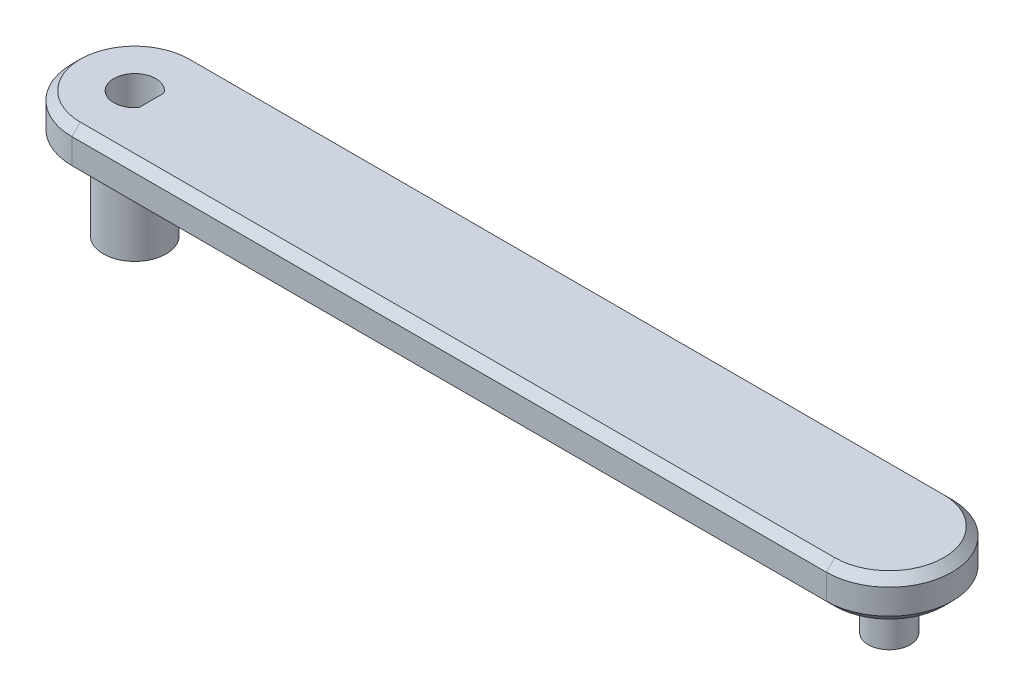
ISO-10303-21;
HEADER;
FILE_DESCRIPTION(('STEP AP214'),'2;1');
FILE_NAME('part.step','',(''),(''),'','','');
FILE_SCHEMA(('AUTOMOTIVE_DESIGN { 1 0 10303 214 1 1 1 1 }'));
ENDSEC;
DATA;
#1=APPLICATION_CONTEXT('core data for automotive mechanical design processes');
#2=APPLICATION_PROTOCOL_DEFINITION('international standard','automotive_design',2000,#1);
#3=PRODUCT_CONTEXT('',#1,'mechanical');
#4=PRODUCT('Part','Part','',(#3));
#5=PRODUCT_RELATED_PRODUCT_CATEGORY('part','',(#4));
#6=PRODUCT_DEFINITION_FORMATION('','',#4);
#7=PRODUCT_DEFINITION_CONTEXT('part definition',#1,'design');
#8=PRODUCT_DEFINITION('design','',#6,#7);
#9=PRODUCT_DEFINITION_SHAPE('','',#8);
#10=(LENGTH_UNIT() NAMED_UNIT(*) SI_UNIT(.MILLI.,.METRE.));
#11=(NAMED_UNIT(*) PLANE_ANGLE_UNIT() SI_UNIT($,.RADIAN.));
#12=(NAMED_UNIT(*) SI_UNIT($,.STERADIAN.) SOLID_ANGLE_UNIT());
#13=UNCERTAINTY_MEASURE_WITH_UNIT(LENGTH_MEASURE(1.E-05),#10,'distance_accuracy_value','');
#14=(GEOMETRIC_REPRESENTATION_CONTEXT(3) GLOBAL_UNCERTAINTY_ASSIGNED_CONTEXT((#13)) GLOBAL_UNIT_ASSIGNED_CONTEXT((#10,
#11,#12)) REPRESENTATION_CONTEXT('',''));
#15=CARTESIAN_POINT('',(0.,0.,0.));
#16=DIRECTION('',(0.,0.,1.));
#17=DIRECTION('',(1.,0.,0.));
#18=AXIS2_PLACEMENT_3D('',#15,#16,#17);
#19=CARTESIAN_POINT('',(180.,10.,0.));
#20=DIRECTION('',(0.,1.,0.));
#21=DIRECTION('',(0.,0.,1.));
#22=AXIS2_PLACEMENT_3D('',#19,#20,#21);
#23=PLANE('',#22);
#24=DIRECTION('',(-1.,0.,0.));
#25=VECTOR('',#24,1.);
#26=CARTESIAN_POINT('',(180.,10.,-13.0000000000001));
#27=LINE('',#26,#25);
#28=CARTESIAN_POINT('',(180.,10.,-13.0000000000001));
#29=VERTEX_POINT('',#28);
#30=CARTESIAN_POINT('',(0.,10.,-13.0000000000001));
#31=VERTEX_POINT('',#30);
#32=EDGE_CURVE('E148',#29,#31,#27,.T.);
#33=ORIENTED_EDGE('',*,*,#32,.T.);
#34=CARTESIAN_POINT('',(0.,10.,0.));
#35=DIRECTION('',(0.,1.,0.));
#36=DIRECTION('',(0.,0.,1.));
#37=AXIS2_PLACEMENT_3D('',#34,#35,#36);
#38=CIRCLE('',#37,13.0000000000001);
#39=CARTESIAN_POINT('',(0.,10.,13.0000000000001));
#40=VERTEX_POINT('',#39);
#41=EDGE_CURVE('E152',#31,#40,#38,.T.);
#42=ORIENTED_EDGE('',*,*,#41,.T.);
#43=DIRECTION('',(1.,0.,0.));
#44=VECTOR('',#43,1.);
#45=CARTESIAN_POINT('',(180.,10.,13.0000000000001));
#46=LINE('',#45,#44);
#47=CARTESIAN_POINT('',(180.,10.,13.0000000000001));
#48=VERTEX_POINT('',#47);
#49=EDGE_CURVE('E150',#40,#48,#46,.T.);
#50=ORIENTED_EDGE('',*,*,#49,.T.);
#51=CARTESIAN_POINT('',(180.,10.,0.));
#52=DIRECTION('',(0.,1.,0.));
#53=DIRECTION('',(0.,0.,1.));
#54=AXIS2_PLACEMENT_3D('',#51,#52,#53);
#55=CIRCLE('',#54,13.0000000000001);
#56=EDGE_CURVE('E146',#48,#29,#55,.T.);
#57=ORIENTED_EDGE('',*,*,#56,.T.);
#58=EDGE_LOOP('',(#33,#42,#50,#57));
#59=FACE_BOUND('',#58,.T.);
#60=DIRECTION('',(0.,0.,-1.));
#61=VECTOR('',#60,1.);
#62=CARTESIAN_POINT('',(4.,10.,3.));
#63=LINE('',#62,#61);
#64=CARTESIAN_POINT('',(4.,10.,3.));
#65=VERTEX_POINT('',#64);
#66=CARTESIAN_POINT('',(4.,10.,-3.));
#67=VERTEX_POINT('',#66);
#68=EDGE_CURVE('E120',#65,#67,#63,.T.);
#69=ORIENTED_EDGE('',*,*,#68,.F.);
#70=CARTESIAN_POINT('',(0.,10.,0.));
#71=DIRECTION('',(0.,-1.,0.));
#72=DIRECTION('',(0.,0.,-1.));
#73=AXIS2_PLACEMENT_3D('',#70,#71,#72);
#74=CIRCLE('',#73,5.);
#75=EDGE_CURVE('E53',#65,#67,#74,.T.);
#76=ORIENTED_EDGE('',*,*,#75,.T.);
#77=EDGE_LOOP('',(#69,#76));
#78=FACE_BOUND('',#77,.T.);
#79=ADVANCED_FACE('F37',(#59,#78),#23,.T.);
#80=CARTESIAN_POINT('',(0.,-20.,0.));
#81=DIRECTION('',(0.,-1.,0.));
#82=DIRECTION('',(0.,0.,-1.));
#83=AXIS2_PLACEMENT_3D('',#80,#81,#82);
#84=PLANE('',#83);
#85=CARTESIAN_POINT('',(0.,-20.,0.));
#86=DIRECTION('',(0.,-1.,0.));
#87=DIRECTION('',(0.,0.,-1.));
#88=AXIS2_PLACEMENT_3D('',#85,#86,#87);
#89=CIRCLE('',#88,7.5);
#90=CARTESIAN_POINT('',(0.,-20.,-7.5));
#91=VERTEX_POINT('',#90);
#92=EDGE_CURVE('E116',#91,#91,#89,.T.);
#93=ORIENTED_EDGE('',*,*,#92,.T.);
#94=EDGE_LOOP('',(#93));
#95=FACE_BOUND('',#94,.T.);
#96=DIRECTION('',(0.,0.,1.));
#97=VECTOR('',#96,1.);
#98=CARTESIAN_POINT('',(4.,-20.,0.));
#99=LINE('',#98,#97);
#100=CARTESIAN_POINT('',(4.,-20.,-3.));
#101=VERTEX_POINT('',#100);
#102=CARTESIAN_POINT('',(4.,-20.,3.));
#103=VERTEX_POINT('',#102);
#104=EDGE_CURVE('E203',#101,#103,#99,.T.);
#105=ORIENTED_EDGE('',*,*,#104,.F.);
#106=CARTESIAN_POINT('',(0.,-20.,0.));
#107=DIRECTION('',(0.,-1.,0.));
#108=DIRECTION('',(0.,0.,-1.));
#109=AXIS2_PLACEMENT_3D('',#106,#107,#108);
#110=CIRCLE('',#109,5.);
#111=EDGE_CURVE('E46',#101,#103,#110,.F.);
#112=ORIENTED_EDGE('',*,*,#111,.T.);
#113=EDGE_LOOP('',(#105,#112));
#114=FACE_BOUND('',#113,.T.);
#115=ADVANCED_FACE('F205',(#95,#114),#84,.T.);
#116=CARTESIAN_POINT('',(0.,10.,15.));
#117=DIRECTION('',(0.,0.,-1.));
#118=DIRECTION('',(-1.,0.,0.));
#119=AXIS2_PLACEMENT_3D('',#116,#117,#118);
#120=PLANE('',#119);
#121=DIRECTION('',(0.,-1.,0.));
#122=VECTOR('',#121,1.);
#123=CARTESIAN_POINT('',(180.,10.,15.));
#124=LINE('',#123,#122);
#125=CARTESIAN_POINT('',(180.,8.00000000000007,15.));
#126=VERTEX_POINT('',#125);
#127=CARTESIAN_POINT('',(180.,2.,15.));
#128=VERTEX_POINT('',#127);
#129=EDGE_CURVE('E143',#126,#128,#124,.T.);
#130=ORIENTED_EDGE('',*,*,#129,.F.);
#131=DIRECTION('',(-1.,0.,0.));
#132=VECTOR('',#131,1.);
#133=CARTESIAN_POINT('',(0.,8.00000000000007,15.));
#134=LINE('',#133,#132);
#135=CARTESIAN_POINT('',(0.,8.00000000000007,15.));
#136=VERTEX_POINT('',#135);
#137=EDGE_CURVE('E162',#126,#136,#134,.T.);
#138=ORIENTED_EDGE('',*,*,#137,.T.);
#139=DIRECTION('',(0.,-1.,0.));
#140=VECTOR('',#139,1.);
#141=CARTESIAN_POINT('',(0.,10.,15.));
#142=LINE('',#141,#140);
#143=CARTESIAN_POINT('',(0.,2.,15.));
#144=VERTEX_POINT('',#143);
#145=EDGE_CURVE('E133',#136,#144,#142,.T.);
#146=ORIENTED_EDGE('',*,*,#145,.T.);
#147=DIRECTION('',(1.,0.,0.));
#148=VECTOR('',#147,1.);
#149=CARTESIAN_POINT('',(0.,2.,15.));
#150=LINE('',#149,#148);
#151=EDGE_CURVE('E160',#144,#128,#150,.T.);
#152=ORIENTED_EDGE('',*,*,#151,.T.);
#153=EDGE_LOOP('',(#130,#138,#146,#152));
#154=FACE_BOUND('',#153,.T.);
#155=ADVANCED_FACE('F207',(#154),#120,.F.);
#156=CARTESIAN_POINT('',(180.,10.,0.));
#157=DIRECTION('',(0.,-1.,0.));
#158=DIRECTION('',(0.,0.,-1.));
#159=AXIS2_PLACEMENT_3D('',#156,#157,#158);
#160=CYLINDRICAL_SURFACE('',#159,15.);
#161=DIRECTION('',(0.,-1.,0.));
#162=VECTOR('',#161,1.);
#163=CARTESIAN_POINT('',(180.,10.,-15.));
#164=LINE('',#163,#162);
#165=CARTESIAN_POINT('',(180.,8.00000000000007,-15.));
#166=VERTEX_POINT('',#165);
#167=CARTESIAN_POINT('',(180.,2.,-15.));
#168=VERTEX_POINT('',#167);
#169=EDGE_CURVE('E140',#166,#168,#164,.T.);
#170=ORIENTED_EDGE('',*,*,#169,.F.);
#171=CARTESIAN_POINT('',(180.,8.00000000000007,0.));
#172=DIRECTION('',(0.,1.,0.));
#173=DIRECTION('',(0.,0.,1.));
#174=AXIS2_PLACEMENT_3D('',#171,#172,#173);
#175=CIRCLE('',#174,15.);
#176=EDGE_CURVE('E171',#166,#126,#175,.F.);
#177=ORIENTED_EDGE('',*,*,#176,.T.);
#178=ORIENTED_EDGE('',*,*,#129,.T.);
#179=CARTESIAN_POINT('',(180.,2.,0.));
#180=DIRECTION('',(0.,1.,0.));
#181=DIRECTION('',(0.,0.,1.));
#182=AXIS2_PLACEMENT_3D('',#179,#180,#181);
#183=CIRCLE('',#182,15.);
#184=EDGE_CURVE('E168',#128,#168,#183,.T.);
#185=ORIENTED_EDGE('',*,*,#184,.T.);
#186=EDGE_LOOP('',(#170,#177,#178,#185));
#187=FACE_BOUND('',#186,.T.);
#188=ADVANCED_FACE('F214',(#187),#160,.T.);
#189=CARTESIAN_POINT('',(0.,10.,-15.));
#190=DIRECTION('',(0.,0.,-1.));
#191=DIRECTION('',(-1.,0.,0.));
#192=AXIS2_PLACEMENT_3D('',#189,#190,#191);
#193=PLANE('',#192);
#194=DIRECTION('',(0.,-1.,0.));
#195=VECTOR('',#194,1.);
#196=CARTESIAN_POINT('',(0.,10.,-15.));
#197=LINE('',#196,#195);
#198=CARTESIAN_POINT('',(0.,8.00000000000007,-15.));
#199=VERTEX_POINT('',#198);
#200=CARTESIAN_POINT('',(0.,2.,-15.));
#201=VERTEX_POINT('',#200);
#202=EDGE_CURVE('E136',#199,#201,#197,.T.);
#203=ORIENTED_EDGE('',*,*,#202,.F.);
#204=DIRECTION('',(1.,0.,0.));
#205=VECTOR('',#204,1.);
#206=CARTESIAN_POINT('',(0.,8.00000000000007,-15.));
#207=LINE('',#206,#205);
#208=EDGE_CURVE('E166',#199,#166,#207,.T.);
#209=ORIENTED_EDGE('',*,*,#208,.T.);
#210=ORIENTED_EDGE('',*,*,#169,.T.);
#211=DIRECTION('',(-1.,0.,0.));
#212=VECTOR('',#211,1.);
#213=CARTESIAN_POINT('',(0.,2.,-15.));
#214=LINE('',#213,#212);
#215=EDGE_CURVE('E164',#168,#201,#214,.T.);
#216=ORIENTED_EDGE('',*,*,#215,.T.);
#217=EDGE_LOOP('',(#203,#209,#210,#216));
#218=FACE_BOUND('',#217,.T.);
#219=ADVANCED_FACE('F235',(#218),#193,.T.);
#220=CARTESIAN_POINT('',(0.,10.,0.));
#221=DIRECTION('',(0.,-1.,0.));
#222=DIRECTION('',(0.,0.,-1.));
#223=AXIS2_PLACEMENT_3D('',#220,#221,#222);
#224=CYLINDRICAL_SURFACE('',#223,15.);
#225=ORIENTED_EDGE('',*,*,#145,.F.);
#226=CARTESIAN_POINT('',(0.,8.00000000000007,0.));
#227=DIRECTION('',(0.,1.,0.));
#228=DIRECTION('',(0.,0.,1.));
#229=AXIS2_PLACEMENT_3D('',#226,#227,#228);
#230=CIRCLE('',#229,15.);
#231=EDGE_CURVE('E157',#136,#199,#230,.F.);
#232=ORIENTED_EDGE('',*,*,#231,.T.);
#233=ORIENTED_EDGE('',*,*,#202,.T.);
#234=CARTESIAN_POINT('',(0.,2.,0.));
#235=DIRECTION('',(0.,1.,0.));
#236=DIRECTION('',(0.,0.,1.));
#237=AXIS2_PLACEMENT_3D('',#234,#235,#236);
#238=CIRCLE('',#237,15.);
#239=EDGE_CURVE('E155',#201,#144,#238,.T.);
#240=ORIENTED_EDGE('',*,*,#239,.T.);
#241=EDGE_LOOP('',(#225,#232,#233,#240));
#242=FACE_BOUND('',#241,.T.);
#243=ADVANCED_FACE('F231',(#242),#224,.T.);
#244=CARTESIAN_POINT('',(180.,0.,0.));
#245=DIRECTION('',(0.,1.,0.));
#246=DIRECTION('',(0.,0.,1.));
#247=AXIS2_PLACEMENT_3D('',#244,#245,#246);
#248=PLANE('',#247);
#249=CARTESIAN_POINT('',(180.,0.,0.));
#250=DIRECTION('',(0.,1.,0.));
#251=DIRECTION('',(0.,0.,1.));
#252=AXIS2_PLACEMENT_3D('',#249,#250,#251);
#253=CIRCLE('',#252,4.99999999999999);
#254=CARTESIAN_POINT('',(180.,0.,4.99999999999999));
#255=VERTEX_POINT('',#254);
#256=EDGE_CURVE('E11',#255,#255,#253,.F.);
#257=ORIENTED_EDGE('',*,*,#256,.F.);
#258=EDGE_LOOP('',(#257));
#259=FACE_BOUND('',#258,.T.);
#260=CARTESIAN_POINT('',(0.,0.,0.));
#261=DIRECTION('',(0.,1.,0.));
#262=DIRECTION('',(0.,0.,1.));
#263=AXIS2_PLACEMENT_3D('',#260,#261,#262);
#264=CIRCLE('',#263,7.5);
#265=CARTESIAN_POINT('',(0.,0.,7.5));
#266=VERTEX_POINT('',#265);
#267=EDGE_CURVE('E182',#266,#266,#264,.F.);
#268=ORIENTED_EDGE('',*,*,#267,.F.);
#269=EDGE_LOOP('',(#268));
#270=FACE_BOUND('',#269,.T.);
#271=DIRECTION('',(1.,0.,0.));
#272=VECTOR('',#271,1.);
#273=CARTESIAN_POINT('',(180.,0.,-13.));
#274=LINE('',#273,#272);
#275=CARTESIAN_POINT('',(0.,0.,-13.));
#276=VERTEX_POINT('',#275);
#277=CARTESIAN_POINT('',(180.,0.,-13.));
#278=VERTEX_POINT('',#277);
#279=EDGE_CURVE('E173',#276,#278,#274,.T.);
#280=ORIENTED_EDGE('',*,*,#279,.T.);
#281=CARTESIAN_POINT('',(180.,0.,0.));
#282=DIRECTION('',(0.,1.,0.));
#283=DIRECTION('',(0.,0.,1.));
#284=AXIS2_PLACEMENT_3D('',#281,#282,#283);
#285=CIRCLE('',#284,13.);
#286=CARTESIAN_POINT('',(180.,0.,13.));
#287=VERTEX_POINT('',#286);
#288=EDGE_CURVE('E179',#278,#287,#285,.F.);
#289=ORIENTED_EDGE('',*,*,#288,.T.);
#290=DIRECTION('',(-1.,0.,0.));
#291=VECTOR('',#290,1.);
#292=CARTESIAN_POINT('',(180.,0.,13.));
#293=LINE('',#292,#291);
#294=CARTESIAN_POINT('',(0.,0.,13.));
#295=VERTEX_POINT('',#294);
#296=EDGE_CURVE('E177',#287,#295,#293,.T.);
#297=ORIENTED_EDGE('',*,*,#296,.T.);
#298=CARTESIAN_POINT('',(0.,0.,0.));
#299=DIRECTION('',(0.,1.,0.));
#300=DIRECTION('',(0.,0.,1.));
#301=AXIS2_PLACEMENT_3D('',#298,#299,#300);
#302=CIRCLE('',#301,13.);
#303=EDGE_CURVE('E175',#295,#276,#302,.F.);
#304=ORIENTED_EDGE('',*,*,#303,.T.);
#305=EDGE_LOOP('',(#280,#289,#297,#304));
#306=FACE_BOUND('',#305,.T.);
#307=ADVANCED_FACE('F227',(#259,#270,#306),#248,.F.);
#308=CARTESIAN_POINT('',(180.,10.,0.));
#309=DIRECTION('',(0.,-1.,0.));
#310=DIRECTION('',(0.,0.,-1.));
#311=AXIS2_PLACEMENT_3D('',#308,#309,#310);
#312=CONICAL_SURFACE('',#311,13.0000000000001,0.785398163397445);
#313=DIRECTION('',(0.,0.70710678118655,-0.707106781186545));
#314=VECTOR('',#313,1.);
#315=CARTESIAN_POINT('',(180.,8.00000000000007,15.));
#316=LINE('',#315,#314);
#317=EDGE_CURVE('E188',#126,#48,#316,.T.);
#318=ORIENTED_EDGE('',*,*,#317,.F.);
#319=ORIENTED_EDGE('',*,*,#176,.F.);
#320=DIRECTION('',(0.,-0.70710678118655,-0.707106781186545));
#321=VECTOR('',#320,1.);
#322=CARTESIAN_POINT('',(180.,10.,-13.0000000000001));
#323=LINE('',#322,#321);
#324=EDGE_CURVE('E137',#29,#166,#323,.T.);
#325=ORIENTED_EDGE('',*,*,#324,.F.);
#326=ORIENTED_EDGE('',*,*,#56,.F.);
#327=EDGE_LOOP('',(#318,#319,#325,#326));
#328=FACE_BOUND('',#327,.T.);
#329=ADVANCED_FACE('F230',(#328),#312,.T.);
#330=CARTESIAN_POINT('',(0.,8.00000000000007,-15.));
#331=DIRECTION('',(0.,-0.707106781186545,0.70710678118655));
#332=DIRECTION('',(1.,0.,0.));
#333=AXIS2_PLACEMENT_3D('',#330,#331,#332);
#334=PLANE('',#333);
#335=ORIENTED_EDGE('',*,*,#324,.T.);
#336=ORIENTED_EDGE('',*,*,#208,.F.);
#337=DIRECTION('',(0.,-0.70710678118655,-0.707106781186545));
#338=VECTOR('',#337,1.);
#339=CARTESIAN_POINT('',(0.,10.,-13.0000000000001));
#340=LINE('',#339,#338);
#341=EDGE_CURVE('E185',#31,#199,#340,.T.);
#342=ORIENTED_EDGE('',*,*,#341,.F.);
#343=ORIENTED_EDGE('',*,*,#32,.F.);
#344=EDGE_LOOP('',(#335,#336,#342,#343));
#345=FACE_BOUND('',#344,.T.);
#346=ADVANCED_FACE('F257',(#345),#334,.F.);
#347=CARTESIAN_POINT('',(180.,10.,13.0000000000001));
#348=DIRECTION('',(0.,0.707106781186545,0.70710678118655));
#349=DIRECTION('',(-1.,0.,0.));
#350=AXIS2_PLACEMENT_3D('',#347,#348,#349);
#351=PLANE('',#350);
#352=ORIENTED_EDGE('',*,*,#317,.T.);
#353=ORIENTED_EDGE('',*,*,#49,.F.);
#354=DIRECTION('',(0.,0.70710678118655,-0.707106781186545));
#355=VECTOR('',#354,1.);
#356=CARTESIAN_POINT('',(0.,8.00000000000007,15.));
#357=LINE('',#356,#355);
#358=EDGE_CURVE('E183',#136,#40,#357,.T.);
#359=ORIENTED_EDGE('',*,*,#358,.F.);
#360=ORIENTED_EDGE('',*,*,#137,.F.);
#361=EDGE_LOOP('',(#352,#353,#359,#360));
#362=FACE_BOUND('',#361,.T.);
#363=ADVANCED_FACE('F250',(#362),#351,.T.);
#364=CARTESIAN_POINT('',(0.,10.,0.));
#365=DIRECTION('',(0.,-1.,0.));
#366=DIRECTION('',(0.,0.,-1.));
#367=AXIS2_PLACEMENT_3D('',#364,#365,#366);
#368=CONICAL_SURFACE('',#367,13.0000000000001,0.785398163397445);
#369=ORIENTED_EDGE('',*,*,#341,.T.);
#370=ORIENTED_EDGE('',*,*,#231,.F.);
#371=ORIENTED_EDGE('',*,*,#358,.T.);
#372=ORIENTED_EDGE('',*,*,#41,.F.);
#373=EDGE_LOOP('',(#369,#370,#371,#372));
#374=FACE_BOUND('',#373,.T.);
#375=ADVANCED_FACE('F244',(#374),#368,.T.);
#376=CARTESIAN_POINT('',(0.,2.,0.));
#377=DIRECTION('',(0.,1.,0.));
#378=DIRECTION('',(0.,0.,1.));
#379=AXIS2_PLACEMENT_3D('',#376,#377,#378);
#380=CONICAL_SURFACE('',#379,15.,0.785398163397448);
#381=DIRECTION('',(0.,0.707106781186547,-0.707106781186547));
#382=VECTOR('',#381,1.);
#383=CARTESIAN_POINT('',(0.,0.,-13.));
#384=LINE('',#383,#382);
#385=EDGE_CURVE('E196',#276,#201,#384,.T.);
#386=ORIENTED_EDGE('',*,*,#385,.F.);
#387=ORIENTED_EDGE('',*,*,#303,.F.);
#388=DIRECTION('',(0.,-0.707106781186547,-0.707106781186547));
#389=VECTOR('',#388,1.);
#390=CARTESIAN_POINT('',(0.,2.,15.));
#391=LINE('',#390,#389);
#392=EDGE_CURVE('E186',#144,#295,#391,.T.);
#393=ORIENTED_EDGE('',*,*,#392,.F.);
#394=ORIENTED_EDGE('',*,*,#239,.F.);
#395=EDGE_LOOP('',(#386,#387,#393,#394));
#396=FACE_BOUND('',#395,.T.);
#397=ADVANCED_FACE('F40',(#396),#380,.T.);
#398=CARTESIAN_POINT('',(0.,2.,15.));
#399=DIRECTION('',(0.,0.707106781186547,-0.707106781186547));
#400=DIRECTION('',(1.,0.,0.));
#401=AXIS2_PLACEMENT_3D('',#398,#399,#400);
#402=PLANE('',#401);
#403=ORIENTED_EDGE('',*,*,#392,.T.);
#404=ORIENTED_EDGE('',*,*,#296,.F.);
#405=DIRECTION('',(0.,-0.707106781186547,-0.707106781186547));
#406=VECTOR('',#405,1.);
#407=CARTESIAN_POINT('',(180.,2.,15.));
#408=LINE('',#407,#406);
#409=EDGE_CURVE('E194',#128,#287,#408,.T.);
#410=ORIENTED_EDGE('',*,*,#409,.F.);
#411=ORIENTED_EDGE('',*,*,#151,.F.);
#412=EDGE_LOOP('',(#403,#404,#410,#411));
#413=FACE_BOUND('',#412,.T.);
#414=ADVANCED_FACE('F282',(#413),#402,.F.);
#415=CARTESIAN_POINT('',(180.,0.,-13.));
#416=DIRECTION('',(0.,-0.707106781186547,-0.707106781186547));
#417=DIRECTION('',(-1.,0.,0.));
#418=AXIS2_PLACEMENT_3D('',#415,#416,#417);
#419=PLANE('',#418);
#420=ORIENTED_EDGE('',*,*,#385,.T.);
#421=ORIENTED_EDGE('',*,*,#215,.F.);
#422=DIRECTION('',(0.,0.707106781186547,-0.707106781186547));
#423=VECTOR('',#422,1.);
#424=CARTESIAN_POINT('',(180.,0.,-13.));
#425=LINE('',#424,#423);
#426=EDGE_CURVE('E132',#278,#168,#425,.T.);
#427=ORIENTED_EDGE('',*,*,#426,.F.);
#428=ORIENTED_EDGE('',*,*,#279,.F.);
#429=EDGE_LOOP('',(#420,#421,#427,#428));
#430=FACE_BOUND('',#429,.T.);
#431=ADVANCED_FACE('F276',(#430),#419,.T.);
#432=CARTESIAN_POINT('',(180.,2.,0.));
#433=DIRECTION('',(0.,1.,0.));
#434=DIRECTION('',(0.,0.,1.));
#435=AXIS2_PLACEMENT_3D('',#432,#433,#434);
#436=CONICAL_SURFACE('',#435,15.,0.785398163397448);
#437=ORIENTED_EDGE('',*,*,#409,.T.);
#438=ORIENTED_EDGE('',*,*,#288,.F.);
#439=ORIENTED_EDGE('',*,*,#426,.T.);
#440=ORIENTED_EDGE('',*,*,#184,.F.);
#441=EDGE_LOOP('',(#437,#438,#439,#440));
#442=FACE_BOUND('',#441,.T.);
#443=ADVANCED_FACE('F224',(#442),#436,.T.);
#444=CARTESIAN_POINT('',(0.,-20.,0.));
#445=DIRECTION('',(0.,1.,0.));
#446=DIRECTION('',(0.,0.,1.));
#447=AXIS2_PLACEMENT_3D('',#444,#445,#446);
#448=CYLINDRICAL_SURFACE('',#447,7.5);
#449=ORIENTED_EDGE('',*,*,#92,.F.);
#450=EDGE_LOOP('',(#449));
#451=FACE_BOUND('',#450,.T.);
#452=ORIENTED_EDGE('',*,*,#267,.T.);
#453=EDGE_LOOP('',(#452));
#454=FACE_BOUND('',#453,.T.);
#455=ADVANCED_FACE('F222',(#451,#454),#448,.T.);
#456=CARTESIAN_POINT('',(0.,-24.,0.));
#457=DIRECTION('',(0.,1.,0.));
#458=DIRECTION('',(0.,0.,1.));
#459=AXIS2_PLACEMENT_3D('',#456,#457,#458);
#460=CYLINDRICAL_SURFACE('',#459,5.);
#461=DIRECTION('',(0.,1.,0.));
#462=VECTOR('',#461,1.);
#463=CARTESIAN_POINT('',(4.,-24.,-3.));
#464=LINE('',#463,#462);
#465=EDGE_CURVE('E60',#101,#67,#464,.T.);
#466=ORIENTED_EDGE('',*,*,#465,.T.);
#467=ORIENTED_EDGE('',*,*,#75,.F.);
#468=DIRECTION('',(0.,1.,0.));
#469=VECTOR('',#468,1.);
#470=CARTESIAN_POINT('',(4.,-24.,3.));
#471=LINE('',#470,#469);
#472=EDGE_CURVE('E117',#103,#65,#471,.T.);
#473=ORIENTED_EDGE('',*,*,#472,.F.);
#474=ORIENTED_EDGE('',*,*,#111,.F.);
#475=EDGE_LOOP('',(#466,#467,#473,#474));
#476=FACE_BOUND('',#475,.T.);
#477=ADVANCED_FACE('F113',(#476),#460,.F.);
#478=CARTESIAN_POINT('',(4.,-24.,3.));
#479=DIRECTION('',(1.,0.,0.));
#480=DIRECTION('',(0.,0.,-1.));
#481=AXIS2_PLACEMENT_3D('',#478,#479,#480);
#482=PLANE('',#481);
#483=ORIENTED_EDGE('',*,*,#104,.T.);
#484=ORIENTED_EDGE('',*,*,#472,.T.);
#485=ORIENTED_EDGE('',*,*,#68,.T.);
#486=ORIENTED_EDGE('',*,*,#465,.F.);
#487=EDGE_LOOP('',(#483,#484,#485,#486));
#488=FACE_BOUND('',#487,.T.);
#489=ADVANCED_FACE('F121',(#488),#482,.F.);
#490=CARTESIAN_POINT('',(180.,-12.,0.));
#491=DIRECTION('',(0.,1.,0.));
#492=DIRECTION('',(0.,0.,1.));
#493=AXIS2_PLACEMENT_3D('',#490,#491,#492);
#494=CYLINDRICAL_SURFACE('',#493,4.99999999999999);
#495=CARTESIAN_POINT('',(180.,-12.,0.));
#496=DIRECTION('',(0.,-1.,0.));
#497=DIRECTION('',(0.,0.,-1.));
#498=AXIS2_PLACEMENT_3D('',#495,#496,#497);
#499=CIRCLE('',#498,4.99999999999999);
#500=CARTESIAN_POINT('',(180.,-12.,-4.99999999999999));
#501=VERTEX_POINT('',#500);
#502=EDGE_CURVE('E124',#501,#501,#499,.T.);
#503=ORIENTED_EDGE('',*,*,#502,.F.);
#504=EDGE_LOOP('',(#503));
#505=FACE_BOUND('',#504,.T.);
#506=ORIENTED_EDGE('',*,*,#256,.T.);
#507=EDGE_LOOP('',(#506));
#508=FACE_BOUND('',#507,.T.);
#509=ADVANCED_FACE('F422',(#505,#508),#494,.T.);
#510=CARTESIAN_POINT('',(180.,-12.,0.));
#511=DIRECTION('',(0.,-1.,0.));
#512=DIRECTION('',(0.,0.,-1.));
#513=AXIS2_PLACEMENT_3D('',#510,#511,#512);
#514=PLANE('',#513);
#515=ORIENTED_EDGE('',*,*,#502,.T.);
#516=EDGE_LOOP('',(#515));
#517=FACE_BOUND('',#516,.T.);
#518=ADVANCED_FACE('F428',(#517),#514,.T.);
#519=CLOSED_SHELL('',(#79,#115,#155,#188,#219,#243,#307,#329,#346,#363,#375,#397,#414,#431,#443,
#455,#477,#489,#509,#518));
#520=MANIFOLD_SOLID_BREP('B2',#519);
#521=ADVANCED_BREP_SHAPE_REPRESENTATION('',(#18,#520),#14);
#522=SHAPE_DEFINITION_REPRESENTATION(#9,#521);
ENDSEC;
END-ISO-10303-21;
